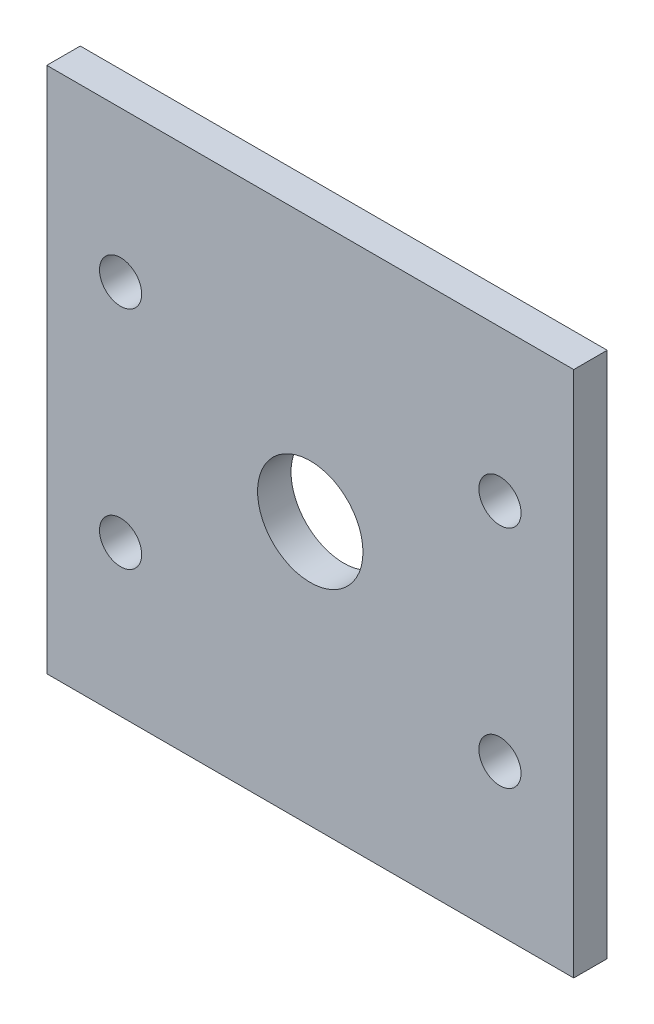
ISO-10303-21;
HEADER;
FILE_DESCRIPTION(('STEP AP214'),'2;1');
FILE_NAME('part.step','',(''),(''),'','','');
FILE_SCHEMA(('AUTOMOTIVE_DESIGN { 1 0 10303 214 1 1 1 1 }'));
ENDSEC;
DATA;
#1=APPLICATION_CONTEXT('core data for automotive mechanical design processes');
#2=APPLICATION_PROTOCOL_DEFINITION('international standard','automotive_design',2000,#1);
#3=PRODUCT_CONTEXT('',#1,'mechanical');
#4=PRODUCT('Part','Part','',(#3));
#5=PRODUCT_RELATED_PRODUCT_CATEGORY('part','',(#4));
#6=PRODUCT_DEFINITION_FORMATION('','',#4);
#7=PRODUCT_DEFINITION_CONTEXT('part definition',#1,'design');
#8=PRODUCT_DEFINITION('design','',#6,#7);
#9=PRODUCT_DEFINITION_SHAPE('','',#8);
#10=(LENGTH_UNIT() NAMED_UNIT(*) SI_UNIT(.MILLI.,.METRE.));
#11=(NAMED_UNIT(*) PLANE_ANGLE_UNIT() SI_UNIT($,.RADIAN.));
#12=(NAMED_UNIT(*) SI_UNIT($,.STERADIAN.) SOLID_ANGLE_UNIT());
#13=UNCERTAINTY_MEASURE_WITH_UNIT(LENGTH_MEASURE(1.E-05),#10,'distance_accuracy_value','');
#14=(GEOMETRIC_REPRESENTATION_CONTEXT(3) GLOBAL_UNCERTAINTY_ASSIGNED_CONTEXT((#13)) GLOBAL_UNIT_ASSIGNED_CONTEXT((#10,
#11,#12)) REPRESENTATION_CONTEXT('',''));
#15=CARTESIAN_POINT('',(0.,0.,0.));
#16=DIRECTION('',(0.,0.,1.));
#17=DIRECTION('',(1.,0.,0.));
#18=AXIS2_PLACEMENT_3D('',#15,#16,#17);
#19=CARTESIAN_POINT('',(0.,0.,1.5875));
#20=DIRECTION('',(0.,0.,-1.));
#21=DIRECTION('',(-1.,0.,0.));
#22=AXIS2_PLACEMENT_3D('',#19,#20,#21);
#23=PLANE('',#22);
#24=CARTESIAN_POINT('',(-9.,-5.35,1.5875));
#25=DIRECTION('',(0.,0.,1.));
#26=DIRECTION('',(1.,0.,0.));
#27=AXIS2_PLACEMENT_3D('',#24,#25,#26);
#28=CIRCLE('',#27,1.);
#29=CARTESIAN_POINT('',(-8.,-5.35,1.5875));
#30=VERTEX_POINT('',#29);
#31=EDGE_CURVE('E126',#30,#30,#28,.T.);
#32=ORIENTED_EDGE('',*,*,#31,.F.);
#33=EDGE_LOOP('',(#32));
#34=FACE_BOUND('',#33,.T.);
#35=CARTESIAN_POINT('',(-9.,5.35,1.5875));
#36=DIRECTION('',(0.,0.,1.));
#37=DIRECTION('',(1.,0.,0.));
#38=AXIS2_PLACEMENT_3D('',#35,#36,#37);
#39=CIRCLE('',#38,1.);
#40=CARTESIAN_POINT('',(-8.,5.35,1.5875));
#41=VERTEX_POINT('',#40);
#42=EDGE_CURVE('E114',#41,#41,#39,.T.);
#43=ORIENTED_EDGE('',*,*,#42,.F.);
#44=EDGE_LOOP('',(#43));
#45=FACE_BOUND('',#44,.T.);
#46=DIRECTION('',(0.,1.,0.));
#47=VECTOR('',#46,1.);
#48=CARTESIAN_POINT('',(12.5,-12.5,1.5875));
#49=LINE('',#48,#47);
#50=CARTESIAN_POINT('',(12.5,-12.5,1.5875));
#51=VERTEX_POINT('',#50);
#52=CARTESIAN_POINT('',(12.5,12.5,1.5875));
#53=VERTEX_POINT('',#52);
#54=EDGE_CURVE('E84',#51,#53,#49,.T.);
#55=ORIENTED_EDGE('',*,*,#54,.T.);
#56=DIRECTION('',(-1.,0.,0.));
#57=VECTOR('',#56,1.);
#58=CARTESIAN_POINT('',(-12.5,12.5,1.5875));
#59=LINE('',#58,#57);
#60=CARTESIAN_POINT('',(-12.5,12.5,1.5875));
#61=VERTEX_POINT('',#60);
#62=EDGE_CURVE('E79',#53,#61,#59,.T.);
#63=ORIENTED_EDGE('',*,*,#62,.T.);
#64=DIRECTION('',(0.,-1.,0.));
#65=VECTOR('',#64,1.);
#66=CARTESIAN_POINT('',(-12.5,-12.5,1.5875));
#67=LINE('',#66,#65);
#68=CARTESIAN_POINT('',(-12.5,-12.5,1.5875));
#69=VERTEX_POINT('',#68);
#70=EDGE_CURVE('E82',#61,#69,#67,.T.);
#71=ORIENTED_EDGE('',*,*,#70,.T.);
#72=DIRECTION('',(1.,0.,0.));
#73=VECTOR('',#72,1.);
#74=CARTESIAN_POINT('',(-12.5,-12.5,1.5875));
#75=LINE('',#74,#73);
#76=EDGE_CURVE('E49',#69,#51,#75,.T.);
#77=ORIENTED_EDGE('',*,*,#76,.T.);
#78=EDGE_LOOP('',(#55,#63,#71,#77));
#79=FACE_BOUND('',#78,.T.);
#80=CARTESIAN_POINT('',(0.,0.,1.5875));
#81=DIRECTION('',(0.,0.,1.));
#82=DIRECTION('',(1.,0.,0.));
#83=AXIS2_PLACEMENT_3D('',#80,#81,#82);
#84=CIRCLE('',#83,2.5);
#85=CARTESIAN_POINT('',(2.5,0.,1.5875));
#86=VERTEX_POINT('',#85);
#87=EDGE_CURVE('E99',#86,#86,#84,.T.);
#88=ORIENTED_EDGE('',*,*,#87,.F.);
#89=EDGE_LOOP('',(#88));
#90=FACE_BOUND('',#89,.T.);
#91=CARTESIAN_POINT('',(9.,5.35,1.5875));
#92=DIRECTION('',(0.,0.,1.));
#93=DIRECTION('',(1.,0.,0.));
#94=AXIS2_PLACEMENT_3D('',#91,#92,#93);
#95=CIRCLE('',#94,1.);
#96=CARTESIAN_POINT('',(10.,5.35,1.5875));
#97=VERTEX_POINT('',#96);
#98=EDGE_CURVE('E120',#97,#97,#95,.T.);
#99=ORIENTED_EDGE('',*,*,#98,.F.);
#100=EDGE_LOOP('',(#99));
#101=FACE_BOUND('',#100,.T.);
#102=CARTESIAN_POINT('',(9.,-5.35,1.5875));
#103=DIRECTION('',(0.,0.,1.));
#104=DIRECTION('',(1.,0.,0.));
#105=AXIS2_PLACEMENT_3D('',#102,#103,#104);
#106=CIRCLE('',#105,1.);
#107=CARTESIAN_POINT('',(10.,-5.35,1.5875));
#108=VERTEX_POINT('',#107);
#109=EDGE_CURVE('E132',#108,#108,#106,.T.);
#110=ORIENTED_EDGE('',*,*,#109,.F.);
#111=EDGE_LOOP('',(#110));
#112=FACE_BOUND('',#111,.T.);
#113=ADVANCED_FACE('F32',(#34,#45,#79,#90,#101,#112),#23,.F.);
#114=CARTESIAN_POINT('',(0.,0.,0.));
#115=DIRECTION('',(0.,0.,-1.));
#116=DIRECTION('',(-1.,0.,0.));
#117=AXIS2_PLACEMENT_3D('',#114,#115,#116);
#118=PLANE('',#117);
#119=CARTESIAN_POINT('',(-9.,-5.35,0.));
#120=DIRECTION('',(0.,0.,1.));
#121=DIRECTION('',(1.,0.,0.));
#122=AXIS2_PLACEMENT_3D('',#119,#120,#121);
#123=CIRCLE('',#122,1.);
#124=CARTESIAN_POINT('',(-8.,-5.35,0.));
#125=VERTEX_POINT('',#124);
#126=EDGE_CURVE('E129',#125,#125,#123,.T.);
#127=ORIENTED_EDGE('',*,*,#126,.T.);
#128=EDGE_LOOP('',(#127));
#129=FACE_BOUND('',#128,.T.);
#130=CARTESIAN_POINT('',(-9.,5.35,0.));
#131=DIRECTION('',(0.,0.,1.));
#132=DIRECTION('',(1.,0.,0.));
#133=AXIS2_PLACEMENT_3D('',#130,#131,#132);
#134=CIRCLE('',#133,1.);
#135=CARTESIAN_POINT('',(-8.,5.35,0.));
#136=VERTEX_POINT('',#135);
#137=EDGE_CURVE('E117',#136,#136,#134,.T.);
#138=ORIENTED_EDGE('',*,*,#137,.T.);
#139=EDGE_LOOP('',(#138));
#140=FACE_BOUND('',#139,.T.);
#141=DIRECTION('',(0.,1.,0.));
#142=VECTOR('',#141,1.);
#143=CARTESIAN_POINT('',(12.5,-12.5,0.));
#144=LINE('',#143,#142);
#145=CARTESIAN_POINT('',(12.5,-12.5,0.));
#146=VERTEX_POINT('',#145);
#147=CARTESIAN_POINT('',(12.5,12.5,0.));
#148=VERTEX_POINT('',#147);
#149=EDGE_CURVE('E96',#146,#148,#144,.T.);
#150=ORIENTED_EDGE('',*,*,#149,.F.);
#151=DIRECTION('',(1.,0.,0.));
#152=VECTOR('',#151,1.);
#153=CARTESIAN_POINT('',(-12.5,-12.5,0.));
#154=LINE('',#153,#152);
#155=CARTESIAN_POINT('',(-12.5,-12.5,0.));
#156=VERTEX_POINT('',#155);
#157=EDGE_CURVE('E72',#156,#146,#154,.T.);
#158=ORIENTED_EDGE('',*,*,#157,.F.);
#159=DIRECTION('',(0.,-1.,0.));
#160=VECTOR('',#159,1.);
#161=CARTESIAN_POINT('',(-12.5,-12.5,0.));
#162=LINE('',#161,#160);
#163=CARTESIAN_POINT('',(-12.5,12.5,0.));
#164=VERTEX_POINT('',#163);
#165=EDGE_CURVE('E66',#164,#156,#162,.T.);
#166=ORIENTED_EDGE('',*,*,#165,.F.);
#167=DIRECTION('',(-1.,0.,0.));
#168=VECTOR('',#167,1.);
#169=CARTESIAN_POINT('',(-12.5,12.5,0.));
#170=LINE('',#169,#168);
#171=EDGE_CURVE('E88',#148,#164,#170,.T.);
#172=ORIENTED_EDGE('',*,*,#171,.F.);
#173=EDGE_LOOP('',(#150,#158,#166,#172));
#174=FACE_BOUND('',#173,.T.);
#175=CARTESIAN_POINT('',(0.,0.,0.));
#176=DIRECTION('',(0.,0.,1.));
#177=DIRECTION('',(1.,0.,0.));
#178=AXIS2_PLACEMENT_3D('',#175,#176,#177);
#179=CIRCLE('',#178,2.5);
#180=CARTESIAN_POINT('',(2.5,0.,0.));
#181=VERTEX_POINT('',#180);
#182=EDGE_CURVE('E111',#181,#181,#179,.T.);
#183=ORIENTED_EDGE('',*,*,#182,.T.);
#184=EDGE_LOOP('',(#183));
#185=FACE_BOUND('',#184,.T.);
#186=CARTESIAN_POINT('',(9.,5.35,0.));
#187=DIRECTION('',(0.,0.,1.));
#188=DIRECTION('',(1.,0.,0.));
#189=AXIS2_PLACEMENT_3D('',#186,#187,#188);
#190=CIRCLE('',#189,1.);
#191=CARTESIAN_POINT('',(10.,5.35,0.));
#192=VERTEX_POINT('',#191);
#193=EDGE_CURVE('E123',#192,#192,#190,.T.);
#194=ORIENTED_EDGE('',*,*,#193,.T.);
#195=EDGE_LOOP('',(#194));
#196=FACE_BOUND('',#195,.T.);
#197=CARTESIAN_POINT('',(9.,-5.35,0.));
#198=DIRECTION('',(0.,0.,1.));
#199=DIRECTION('',(1.,0.,0.));
#200=AXIS2_PLACEMENT_3D('',#197,#198,#199);
#201=CIRCLE('',#200,1.);
#202=CARTESIAN_POINT('',(10.,-5.35,0.));
#203=VERTEX_POINT('',#202);
#204=EDGE_CURVE('E135',#203,#203,#201,.T.);
#205=ORIENTED_EDGE('',*,*,#204,.T.);
#206=EDGE_LOOP('',(#205));
#207=FACE_BOUND('',#206,.T.);
#208=ADVANCED_FACE('F107',(#129,#140,#174,#185,#196,#207),#118,.T.);
#209=CARTESIAN_POINT('',(12.5,-12.5,1.5875));
#210=DIRECTION('',(-1.,0.,0.));
#211=DIRECTION('',(0.,0.,1.));
#212=AXIS2_PLACEMENT_3D('',#209,#210,#211);
#213=PLANE('',#212);
#214=ORIENTED_EDGE('',*,*,#149,.T.);
#215=DIRECTION('',(0.,0.,-1.));
#216=VECTOR('',#215,1.);
#217=CARTESIAN_POINT('',(12.5,12.5,1.5875));
#218=LINE('',#217,#216);
#219=EDGE_CURVE('E11',#53,#148,#218,.T.);
#220=ORIENTED_EDGE('',*,*,#219,.F.);
#221=ORIENTED_EDGE('',*,*,#54,.F.);
#222=DIRECTION('',(0.,0.,-1.));
#223=VECTOR('',#222,1.);
#224=CARTESIAN_POINT('',(12.5,-12.5,1.5875));
#225=LINE('',#224,#223);
#226=EDGE_CURVE('E92',#51,#146,#225,.T.);
#227=ORIENTED_EDGE('',*,*,#226,.T.);
#228=EDGE_LOOP('',(#214,#220,#221,#227));
#229=FACE_BOUND('',#228,.T.);
#230=ADVANCED_FACE('F34',(#229),#213,.F.);
#231=CARTESIAN_POINT('',(-12.5,12.5,1.5875));
#232=DIRECTION('',(0.,-1.,0.));
#233=DIRECTION('',(0.,0.,-1.));
#234=AXIS2_PLACEMENT_3D('',#231,#232,#233);
#235=PLANE('',#234);
#236=ORIENTED_EDGE('',*,*,#171,.T.);
#237=DIRECTION('',(0.,0.,-1.));
#238=VECTOR('',#237,1.);
#239=CARTESIAN_POINT('',(-12.5,12.5,1.5875));
#240=LINE('',#239,#238);
#241=EDGE_CURVE('E41',#61,#164,#240,.T.);
#242=ORIENTED_EDGE('',*,*,#241,.F.);
#243=ORIENTED_EDGE('',*,*,#62,.F.);
#244=ORIENTED_EDGE('',*,*,#219,.T.);
#245=EDGE_LOOP('',(#236,#242,#243,#244));
#246=FACE_BOUND('',#245,.T.);
#247=ADVANCED_FACE('F87',(#246),#235,.F.);
#248=CARTESIAN_POINT('',(-12.5,-12.5,1.5875));
#249=DIRECTION('',(1.,0.,0.));
#250=DIRECTION('',(0.,0.,-1.));
#251=AXIS2_PLACEMENT_3D('',#248,#249,#250);
#252=PLANE('',#251);
#253=ORIENTED_EDGE('',*,*,#165,.T.);
#254=DIRECTION('',(0.,0.,-1.));
#255=VECTOR('',#254,1.);
#256=CARTESIAN_POINT('',(-12.5,-12.5,1.5875));
#257=LINE('',#256,#255);
#258=EDGE_CURVE('E89',#69,#156,#257,.T.);
#259=ORIENTED_EDGE('',*,*,#258,.F.);
#260=ORIENTED_EDGE('',*,*,#70,.F.);
#261=ORIENTED_EDGE('',*,*,#241,.T.);
#262=EDGE_LOOP('',(#253,#259,#260,#261));
#263=FACE_BOUND('',#262,.T.);
#264=ADVANCED_FACE('F90',(#263),#252,.F.);
#265=CARTESIAN_POINT('',(-12.5,-12.5,1.5875));
#266=DIRECTION('',(0.,1.,0.));
#267=DIRECTION('',(0.,0.,1.));
#268=AXIS2_PLACEMENT_3D('',#265,#266,#267);
#269=PLANE('',#268);
#270=ORIENTED_EDGE('',*,*,#157,.T.);
#271=ORIENTED_EDGE('',*,*,#226,.F.);
#272=ORIENTED_EDGE('',*,*,#76,.F.);
#273=ORIENTED_EDGE('',*,*,#258,.T.);
#274=EDGE_LOOP('',(#270,#271,#272,#273));
#275=FACE_BOUND('',#274,.T.);
#276=ADVANCED_FACE('F104',(#275),#269,.F.);
#277=CARTESIAN_POINT('',(0.,0.,1.5875));
#278=DIRECTION('',(0.,0.,-1.));
#279=DIRECTION('',(-1.,0.,0.));
#280=AXIS2_PLACEMENT_3D('',#277,#278,#279);
#281=CYLINDRICAL_SURFACE('',#280,2.5);
#282=ORIENTED_EDGE('',*,*,#87,.T.);
#283=EDGE_LOOP('',(#282));
#284=FACE_BOUND('',#283,.T.);
#285=ORIENTED_EDGE('',*,*,#182,.F.);
#286=EDGE_LOOP('',(#285));
#287=FACE_BOUND('',#286,.T.);
#288=ADVANCED_FACE('F155',(#284,#287),#281,.F.);
#289=CARTESIAN_POINT('',(-9.,5.35,1.5875));
#290=DIRECTION('',(0.,0.,-1.));
#291=DIRECTION('',(-1.,0.,0.));
#292=AXIS2_PLACEMENT_3D('',#289,#290,#291);
#293=CYLINDRICAL_SURFACE('',#292,1.);
#294=ORIENTED_EDGE('',*,*,#42,.T.);
#295=EDGE_LOOP('',(#294));
#296=FACE_BOUND('',#295,.T.);
#297=ORIENTED_EDGE('',*,*,#137,.F.);
#298=EDGE_LOOP('',(#297));
#299=FACE_BOUND('',#298,.T.);
#300=ADVANCED_FACE('F201',(#296,#299),#293,.F.);
#301=CARTESIAN_POINT('',(9.,5.35,1.5875));
#302=DIRECTION('',(0.,0.,-1.));
#303=DIRECTION('',(-1.,0.,0.));
#304=AXIS2_PLACEMENT_3D('',#301,#302,#303);
#305=CYLINDRICAL_SURFACE('',#304,1.);
#306=ORIENTED_EDGE('',*,*,#98,.T.);
#307=EDGE_LOOP('',(#306));
#308=FACE_BOUND('',#307,.T.);
#309=ORIENTED_EDGE('',*,*,#193,.F.);
#310=EDGE_LOOP('',(#309));
#311=FACE_BOUND('',#310,.T.);
#312=ADVANCED_FACE('F209',(#308,#311),#305,.F.);
#313=CARTESIAN_POINT('',(-9.,-5.35,1.5875));
#314=DIRECTION('',(0.,0.,-1.));
#315=DIRECTION('',(-1.,0.,0.));
#316=AXIS2_PLACEMENT_3D('',#313,#314,#315);
#317=CYLINDRICAL_SURFACE('',#316,1.);
#318=ORIENTED_EDGE('',*,*,#31,.T.);
#319=EDGE_LOOP('',(#318));
#320=FACE_BOUND('',#319,.T.);
#321=ORIENTED_EDGE('',*,*,#126,.F.);
#322=EDGE_LOOP('',(#321));
#323=FACE_BOUND('',#322,.T.);
#324=ADVANCED_FACE('F217',(#320,#323),#317,.F.);
#325=CARTESIAN_POINT('',(9.,-5.35,1.5875));
#326=DIRECTION('',(0.,0.,-1.));
#327=DIRECTION('',(-1.,0.,0.));
#328=AXIS2_PLACEMENT_3D('',#325,#326,#327);
#329=CYLINDRICAL_SURFACE('',#328,1.);
#330=ORIENTED_EDGE('',*,*,#109,.T.);
#331=EDGE_LOOP('',(#330));
#332=FACE_BOUND('',#331,.T.);
#333=ORIENTED_EDGE('',*,*,#204,.F.);
#334=EDGE_LOOP('',(#333));
#335=FACE_BOUND('',#334,.T.);
#336=ADVANCED_FACE('F141',(#332,#335),#329,.F.);
#337=CLOSED_SHELL('',(#113,#208,#230,#247,#264,#276,#288,#300,#312,#324,#336));
#338=MANIFOLD_SOLID_BREP('B2',#337);
#339=ADVANCED_BREP_SHAPE_REPRESENTATION('',(#18,#338),#14);
#340=SHAPE_DEFINITION_REPRESENTATION(#9,#339);
ENDSEC;
END-ISO-10303-21;
